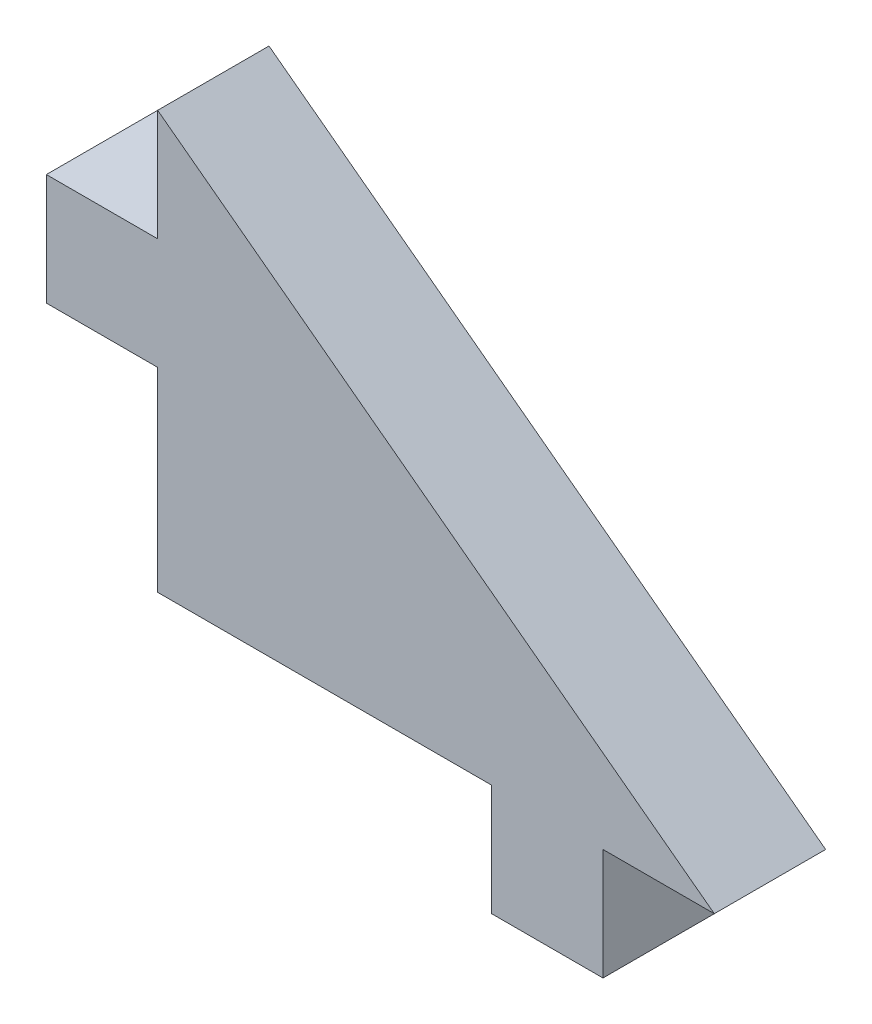
ISO-10303-21;
HEADER;
FILE_DESCRIPTION(('STEP AP214'),'2;1');
FILE_NAME('part.step','',(''),(''),'','','');
FILE_SCHEMA(('AUTOMOTIVE_DESIGN { 1 0 10303 214 1 1 1 1 }'));
ENDSEC;
DATA;
#1=APPLICATION_CONTEXT('core data for automotive mechanical design processes');
#2=APPLICATION_PROTOCOL_DEFINITION('international standard','automotive_design',2000,#1);
#3=PRODUCT_CONTEXT('',#1,'mechanical');
#4=PRODUCT('Part','Part','',(#3));
#5=PRODUCT_RELATED_PRODUCT_CATEGORY('part','',(#4));
#6=PRODUCT_DEFINITION_FORMATION('','',#4);
#7=PRODUCT_DEFINITION_CONTEXT('part definition',#1,'design');
#8=PRODUCT_DEFINITION('design','',#6,#7);
#9=PRODUCT_DEFINITION_SHAPE('','',#8);
#10=(LENGTH_UNIT() NAMED_UNIT(*) SI_UNIT(.MILLI.,.METRE.));
#11=(NAMED_UNIT(*) PLANE_ANGLE_UNIT() SI_UNIT($,.RADIAN.));
#12=(NAMED_UNIT(*) SI_UNIT($,.STERADIAN.) SOLID_ANGLE_UNIT());
#13=UNCERTAINTY_MEASURE_WITH_UNIT(LENGTH_MEASURE(1.E-05),#10,'distance_accuracy_value','');
#14=(GEOMETRIC_REPRESENTATION_CONTEXT(3) GLOBAL_UNCERTAINTY_ASSIGNED_CONTEXT((#13)) GLOBAL_UNIT_ASSIGNED_CONTEXT((#10,
#11,#12)) REPRESENTATION_CONTEXT('',''));
#15=CARTESIAN_POINT('',(0.,0.,0.));
#16=DIRECTION('',(0.,0.,1.));
#17=DIRECTION('',(1.,0.,0.));
#18=AXIS2_PLACEMENT_3D('',#15,#16,#17);
#19=CARTESIAN_POINT('',(0.,0.,8.));
#20=DIRECTION('',(0.,1.,0.));
#21=DIRECTION('',(0.,0.,1.));
#22=AXIS2_PLACEMENT_3D('',#19,#20,#21);
#23=PLANE('',#22);
#24=DIRECTION('',(0.,0.,1.));
#25=VECTOR('',#24,1.);
#26=CARTESIAN_POINT('',(32.,0.,8.));
#27=LINE('',#26,#25);
#28=CARTESIAN_POINT('',(32.,0.,0.));
#29=VERTEX_POINT('',#28);
#30=CARTESIAN_POINT('',(32.,0.,8.));
#31=VERTEX_POINT('',#30);
#32=EDGE_CURVE('E141',#29,#31,#27,.T.);
#33=ORIENTED_EDGE('',*,*,#32,.F.);
#34=DIRECTION('',(1.,0.,0.));
#35=VECTOR('',#34,1.);
#36=CARTESIAN_POINT('',(0.,0.,0.));
#37=LINE('',#36,#35);
#38=CARTESIAN_POINT('',(40.,0.,0.));
#39=VERTEX_POINT('',#38);
#40=EDGE_CURVE('E180',#29,#39,#37,.T.);
#41=ORIENTED_EDGE('',*,*,#40,.T.);
#42=DIRECTION('',(0.,0.,-1.));
#43=VECTOR('',#42,1.);
#44=CARTESIAN_POINT('',(40.,0.,8.));
#45=LINE('',#44,#43);
#46=CARTESIAN_POINT('',(40.,0.,8.));
#47=VERTEX_POINT('',#46);
#48=EDGE_CURVE('E11',#47,#39,#45,.T.);
#49=ORIENTED_EDGE('',*,*,#48,.F.);
#50=DIRECTION('',(1.,0.,0.));
#51=VECTOR('',#50,1.);
#52=CARTESIAN_POINT('',(0.,0.,8.));
#53=LINE('',#52,#51);
#54=EDGE_CURVE('E51',#31,#47,#53,.T.);
#55=ORIENTED_EDGE('',*,*,#54,.F.);
#56=EDGE_LOOP('',(#33,#41,#49,#55));
#57=FACE_BOUND('',#56,.T.);
#58=ADVANCED_FACE('F35',(#57),#23,.F.);
#59=DIRECTION('',(0.,0.,-1.));
#60=VECTOR('',#59,1.);
#61=CARTESIAN_POINT('',(24.,0.,8.));
#62=LINE('',#61,#60);
#63=CARTESIAN_POINT('',(24.,0.,8.));
#64=VERTEX_POINT('',#63);
#65=CARTESIAN_POINT('',(24.,0.,0.));
#66=VERTEX_POINT('',#65);
#67=EDGE_CURVE('E59',#64,#66,#62,.T.);
#68=ORIENTED_EDGE('',*,*,#67,.F.);
#69=CARTESIAN_POINT('',(0.,0.,8.));
#70=VERTEX_POINT('',#69);
#71=EDGE_CURVE('E192',#70,#64,#53,.T.);
#72=ORIENTED_EDGE('',*,*,#71,.F.);
#73=DIRECTION('',(0.,0.,-1.));
#74=VECTOR('',#73,1.);
#75=CARTESIAN_POINT('',(0.,0.,8.));
#76=LINE('',#75,#74);
#77=CARTESIAN_POINT('',(0.,0.,0.));
#78=VERTEX_POINT('',#77);
#79=EDGE_CURVE('E203',#70,#78,#76,.T.);
#80=ORIENTED_EDGE('',*,*,#79,.T.);
#81=EDGE_CURVE('E183',#78,#66,#37,.T.);
#82=ORIENTED_EDGE('',*,*,#81,.T.);
#83=EDGE_LOOP('',(#68,#72,#80,#82));
#84=FACE_BOUND('',#83,.T.);
#85=ADVANCED_FACE('F260',(#84),#23,.F.);
#86=CARTESIAN_POINT('',(0.,0.,8.));
#87=DIRECTION('',(1.,0.,0.));
#88=DIRECTION('',(0.,0.,-1.));
#89=AXIS2_PLACEMENT_3D('',#86,#87,#88);
#90=PLANE('',#89);
#91=DIRECTION('',(0.,0.,-1.));
#92=VECTOR('',#91,1.);
#93=CARTESIAN_POINT('',(0.,22.,0.));
#94=LINE('',#93,#92);
#95=CARTESIAN_POINT('',(0.,22.,8.));
#96=VERTEX_POINT('',#95);
#97=CARTESIAN_POINT('',(0.,22.,0.));
#98=VERTEX_POINT('',#97);
#99=EDGE_CURVE('E145',#96,#98,#94,.T.);
#100=ORIENTED_EDGE('',*,*,#99,.F.);
#101=DIRECTION('',(0.,-1.,0.));
#102=VECTOR('',#101,1.);
#103=CARTESIAN_POINT('',(0.,0.,8.));
#104=LINE('',#103,#102);
#105=CARTESIAN_POINT('',(0.,30.,8.));
#106=VERTEX_POINT('',#105);
#107=EDGE_CURVE('E215',#106,#96,#104,.T.);
#108=ORIENTED_EDGE('',*,*,#107,.F.);
#109=DIRECTION('',(0.,0.,-1.));
#110=VECTOR('',#109,1.);
#111=CARTESIAN_POINT('',(0.,30.,8.));
#112=LINE('',#111,#110);
#113=CARTESIAN_POINT('',(0.,30.,0.));
#114=VERTEX_POINT('',#113);
#115=EDGE_CURVE('E43',#106,#114,#112,.T.);
#116=ORIENTED_EDGE('',*,*,#115,.T.);
#117=DIRECTION('',(0.,-1.,0.));
#118=VECTOR('',#117,1.);
#119=CARTESIAN_POINT('',(0.,0.,0.));
#120=LINE('',#119,#118);
#121=EDGE_CURVE('E209',#114,#98,#120,.T.);
#122=ORIENTED_EDGE('',*,*,#121,.T.);
#123=EDGE_LOOP('',(#100,#108,#116,#122));
#124=FACE_BOUND('',#123,.T.);
#125=ADVANCED_FACE('F262',(#124),#90,.F.);
#126=DIRECTION('',(0.,0.,1.));
#127=VECTOR('',#126,1.);
#128=CARTESIAN_POINT('',(0.,14.,0.));
#129=LINE('',#128,#127);
#130=CARTESIAN_POINT('',(0.,14.,0.));
#131=VERTEX_POINT('',#130);
#132=CARTESIAN_POINT('',(0.,14.,8.));
#133=VERTEX_POINT('',#132);
#134=EDGE_CURVE('E142',#131,#133,#129,.T.);
#135=ORIENTED_EDGE('',*,*,#134,.F.);
#136=EDGE_CURVE('E200',#131,#78,#120,.T.);
#137=ORIENTED_EDGE('',*,*,#136,.T.);
#138=ORIENTED_EDGE('',*,*,#79,.F.);
#139=EDGE_CURVE('E218',#133,#70,#104,.T.);
#140=ORIENTED_EDGE('',*,*,#139,.F.);
#141=EDGE_LOOP('',(#135,#137,#138,#140));
#142=FACE_BOUND('',#141,.T.);
#143=ADVANCED_FACE('F258',(#142),#90,.F.);
#144=CARTESIAN_POINT('',(0.,30.,8.));
#145=DIRECTION('',(-0.6,-0.8,0.));
#146=DIRECTION('',(0.8,-0.6,0.));
#147=AXIS2_PLACEMENT_3D('',#144,#145,#146);
#148=PLANE('',#147);
#149=DIRECTION('',(-0.8,0.6,0.));
#150=VECTOR('',#149,1.);
#151=CARTESIAN_POINT('',(0.,30.,0.));
#152=LINE('',#151,#150);
#153=EDGE_CURVE('E182',#39,#114,#152,.T.);
#154=ORIENTED_EDGE('',*,*,#153,.T.);
#155=ORIENTED_EDGE('',*,*,#115,.F.);
#156=DIRECTION('',(-0.8,0.6,0.));
#157=VECTOR('',#156,1.);
#158=CARTESIAN_POINT('',(0.,30.,8.));
#159=LINE('',#158,#157);
#160=EDGE_CURVE('E221',#47,#106,#159,.T.);
#161=ORIENTED_EDGE('',*,*,#160,.F.);
#162=ORIENTED_EDGE('',*,*,#48,.T.);
#163=EDGE_LOOP('',(#154,#155,#161,#162));
#164=FACE_BOUND('',#163,.T.);
#165=ADVANCED_FACE('F289',(#164),#148,.F.);
#166=CARTESIAN_POINT('',(0.,0.,8.));
#167=DIRECTION('',(0.,0.,1.));
#168=DIRECTION('',(1.,0.,0.));
#169=AXIS2_PLACEMENT_3D('',#166,#167,#168);
#170=PLANE('',#169);
#171=ORIENTED_EDGE('',*,*,#71,.T.);
#172=DIRECTION('',(0.,1.,0.));
#173=VECTOR('',#172,1.);
#174=CARTESIAN_POINT('',(24.,-8.,8.));
#175=LINE('',#174,#173);
#176=CARTESIAN_POINT('',(24.,-8.,8.));
#177=VERTEX_POINT('',#176);
#178=EDGE_CURVE('E126',#177,#64,#175,.T.);
#179=ORIENTED_EDGE('',*,*,#178,.F.);
#180=DIRECTION('',(-1.,0.,0.));
#181=VECTOR('',#180,1.);
#182=CARTESIAN_POINT('',(32.,-8.,8.));
#183=LINE('',#182,#181);
#184=CARTESIAN_POINT('',(32.,-8.,8.));
#185=VERTEX_POINT('',#184);
#186=EDGE_CURVE('E119',#185,#177,#183,.T.);
#187=ORIENTED_EDGE('',*,*,#186,.F.);
#188=DIRECTION('',(0.,1.,0.));
#189=VECTOR('',#188,1.);
#190=CARTESIAN_POINT('',(32.,-8.,8.));
#191=LINE('',#190,#189);
#192=EDGE_CURVE('E123',#185,#31,#191,.T.);
#193=ORIENTED_EDGE('',*,*,#192,.T.);
#194=ORIENTED_EDGE('',*,*,#54,.T.);
#195=ORIENTED_EDGE('',*,*,#160,.T.);
#196=ORIENTED_EDGE('',*,*,#107,.T.);
#197=DIRECTION('',(1.,0.,0.));
#198=VECTOR('',#197,1.);
#199=CARTESIAN_POINT('',(-8.,22.,8.));
#200=LINE('',#199,#198);
#201=CARTESIAN_POINT('',(-8.,22.,8.));
#202=VERTEX_POINT('',#201);
#203=EDGE_CURVE('E241',#202,#96,#200,.T.);
#204=ORIENTED_EDGE('',*,*,#203,.F.);
#205=DIRECTION('',(0.,1.,0.));
#206=VECTOR('',#205,1.);
#207=CARTESIAN_POINT('',(-8.,22.,8.));
#208=LINE('',#207,#206);
#209=CARTESIAN_POINT('',(-8.,14.,8.));
#210=VERTEX_POINT('',#209);
#211=EDGE_CURVE('E250',#210,#202,#208,.T.);
#212=ORIENTED_EDGE('',*,*,#211,.F.);
#213=DIRECTION('',(1.,0.,0.));
#214=VECTOR('',#213,1.);
#215=CARTESIAN_POINT('',(-8.,14.,8.));
#216=LINE('',#215,#214);
#217=EDGE_CURVE('E188',#210,#133,#216,.T.);
#218=ORIENTED_EDGE('',*,*,#217,.T.);
#219=ORIENTED_EDGE('',*,*,#139,.T.);
#220=EDGE_LOOP('',(#171,#179,#187,#193,#194,#195,#196,#204,#212,#218,#219));
#221=FACE_BOUND('',#220,.T.);
#222=ADVANCED_FACE('F121',(#221),#170,.T.);
#223=CARTESIAN_POINT('',(0.,0.,0.));
#224=DIRECTION('',(0.,0.,1.));
#225=DIRECTION('',(1.,0.,0.));
#226=AXIS2_PLACEMENT_3D('',#223,#224,#225);
#227=PLANE('',#226);
#228=ORIENTED_EDGE('',*,*,#81,.F.);
#229=ORIENTED_EDGE('',*,*,#136,.F.);
#230=DIRECTION('',(1.,0.,0.));
#231=VECTOR('',#230,1.);
#232=CARTESIAN_POINT('',(-8.,14.,0.));
#233=LINE('',#232,#231);
#234=CARTESIAN_POINT('',(-8.,14.,0.));
#235=VERTEX_POINT('',#234);
#236=EDGE_CURVE('E184',#235,#131,#233,.T.);
#237=ORIENTED_EDGE('',*,*,#236,.F.);
#238=DIRECTION('',(0.,-1.,0.));
#239=VECTOR('',#238,1.);
#240=CARTESIAN_POINT('',(-8.,22.,0.));
#241=LINE('',#240,#239);
#242=CARTESIAN_POINT('',(-8.,22.,0.));
#243=VERTEX_POINT('',#242);
#244=EDGE_CURVE('E162',#243,#235,#241,.T.);
#245=ORIENTED_EDGE('',*,*,#244,.F.);
#246=DIRECTION('',(1.,0.,0.));
#247=VECTOR('',#246,1.);
#248=CARTESIAN_POINT('',(-8.,22.,0.));
#249=LINE('',#248,#247);
#250=EDGE_CURVE('E238',#243,#98,#249,.T.);
#251=ORIENTED_EDGE('',*,*,#250,.T.);
#252=ORIENTED_EDGE('',*,*,#121,.F.);
#253=ORIENTED_EDGE('',*,*,#153,.F.);
#254=ORIENTED_EDGE('',*,*,#40,.F.);
#255=DIRECTION('',(0.,1.,0.));
#256=VECTOR('',#255,1.);
#257=CARTESIAN_POINT('',(32.,-8.,0.));
#258=LINE('',#257,#256);
#259=CARTESIAN_POINT('',(32.,-8.,0.));
#260=VERTEX_POINT('',#259);
#261=EDGE_CURVE('E155',#260,#29,#258,.T.);
#262=ORIENTED_EDGE('',*,*,#261,.F.);
#263=DIRECTION('',(1.,0.,0.));
#264=VECTOR('',#263,1.);
#265=CARTESIAN_POINT('',(32.,-8.,0.));
#266=LINE('',#265,#264);
#267=CARTESIAN_POINT('',(24.,-8.,0.));
#268=VERTEX_POINT('',#267);
#269=EDGE_CURVE('E135',#268,#260,#266,.T.);
#270=ORIENTED_EDGE('',*,*,#269,.F.);
#271=DIRECTION('',(0.,1.,0.));
#272=VECTOR('',#271,1.);
#273=CARTESIAN_POINT('',(24.,-8.,0.));
#274=LINE('',#273,#272);
#275=EDGE_CURVE('E147',#268,#66,#274,.T.);
#276=ORIENTED_EDGE('',*,*,#275,.T.);
#277=EDGE_LOOP('',(#228,#229,#237,#245,#251,#252,#253,#254,#262,#270,#276));
#278=FACE_BOUND('',#277,.T.);
#279=ADVANCED_FACE('F177',(#278),#227,.F.);
#280=CARTESIAN_POINT('',(-8.,14.,0.));
#281=DIRECTION('',(0.,1.,0.));
#282=DIRECTION('',(0.,0.,1.));
#283=AXIS2_PLACEMENT_3D('',#280,#281,#282);
#284=PLANE('',#283);
#285=ORIENTED_EDGE('',*,*,#134,.T.);
#286=ORIENTED_EDGE('',*,*,#217,.F.);
#287=DIRECTION('',(0.,0.,1.));
#288=VECTOR('',#287,1.);
#289=CARTESIAN_POINT('',(-8.,14.,0.));
#290=LINE('',#289,#288);
#291=EDGE_CURVE('E253',#235,#210,#290,.T.);
#292=ORIENTED_EDGE('',*,*,#291,.F.);
#293=ORIENTED_EDGE('',*,*,#236,.T.);
#294=EDGE_LOOP('',(#285,#286,#292,#293));
#295=FACE_BOUND('',#294,.T.);
#296=ADVANCED_FACE('F252',(#295),#284,.F.);
#297=CARTESIAN_POINT('',(-8.,22.,0.));
#298=DIRECTION('',(0.,-1.,0.));
#299=DIRECTION('',(0.,0.,-1.));
#300=AXIS2_PLACEMENT_3D('',#297,#298,#299);
#301=PLANE('',#300);
#302=ORIENTED_EDGE('',*,*,#99,.T.);
#303=ORIENTED_EDGE('',*,*,#250,.F.);
#304=DIRECTION('',(0.,0.,-1.));
#305=VECTOR('',#304,1.);
#306=CARTESIAN_POINT('',(-8.,22.,0.));
#307=LINE('',#306,#305);
#308=EDGE_CURVE('E229',#202,#243,#307,.T.);
#309=ORIENTED_EDGE('',*,*,#308,.F.);
#310=ORIENTED_EDGE('',*,*,#203,.T.);
#311=EDGE_LOOP('',(#302,#303,#309,#310));
#312=FACE_BOUND('',#311,.T.);
#313=ADVANCED_FACE('F331',(#312),#301,.F.);
#314=CARTESIAN_POINT('',(-8.,14.,0.));
#315=DIRECTION('',(-1.,0.,0.));
#316=DIRECTION('',(0.,0.,1.));
#317=AXIS2_PLACEMENT_3D('',#314,#315,#316);
#318=PLANE('',#317);
#319=ORIENTED_EDGE('',*,*,#244,.T.);
#320=ORIENTED_EDGE('',*,*,#291,.T.);
#321=ORIENTED_EDGE('',*,*,#211,.T.);
#322=ORIENTED_EDGE('',*,*,#308,.T.);
#323=EDGE_LOOP('',(#319,#320,#321,#322));
#324=FACE_BOUND('',#323,.T.);
#325=ADVANCED_FACE('F277',(#324),#318,.T.);
#326=CARTESIAN_POINT('',(32.,-8.,8.));
#327=DIRECTION('',(-1.,0.,0.));
#328=DIRECTION('',(0.,0.,1.));
#329=AXIS2_PLACEMENT_3D('',#326,#327,#328);
#330=PLANE('',#329);
#331=ORIENTED_EDGE('',*,*,#32,.T.);
#332=ORIENTED_EDGE('',*,*,#192,.F.);
#333=DIRECTION('',(0.,0.,1.));
#334=VECTOR('',#333,1.);
#335=CARTESIAN_POINT('',(32.,-8.,8.));
#336=LINE('',#335,#334);
#337=EDGE_CURVE('E130',#260,#185,#336,.T.);
#338=ORIENTED_EDGE('',*,*,#337,.F.);
#339=ORIENTED_EDGE('',*,*,#261,.T.);
#340=EDGE_LOOP('',(#331,#332,#338,#339));
#341=FACE_BOUND('',#340,.T.);
#342=ADVANCED_FACE('F140',(#341),#330,.F.);
#343=CARTESIAN_POINT('',(24.,-8.,8.));
#344=DIRECTION('',(1.,0.,0.));
#345=DIRECTION('',(0.,0.,-1.));
#346=AXIS2_PLACEMENT_3D('',#343,#344,#345);
#347=PLANE('',#346);
#348=ORIENTED_EDGE('',*,*,#67,.T.);
#349=ORIENTED_EDGE('',*,*,#275,.F.);
#350=DIRECTION('',(0.,0.,-1.));
#351=VECTOR('',#350,1.);
#352=CARTESIAN_POINT('',(24.,-8.,8.));
#353=LINE('',#352,#351);
#354=EDGE_CURVE('E129',#177,#268,#353,.T.);
#355=ORIENTED_EDGE('',*,*,#354,.F.);
#356=ORIENTED_EDGE('',*,*,#178,.T.);
#357=EDGE_LOOP('',(#348,#349,#355,#356));
#358=FACE_BOUND('',#357,.T.);
#359=ADVANCED_FACE('F176',(#358),#347,.F.);
#360=CARTESIAN_POINT('',(32.,-8.,0.));
#361=DIRECTION('',(0.,1.,0.));
#362=DIRECTION('',(0.,0.,1.));
#363=AXIS2_PLACEMENT_3D('',#360,#361,#362);
#364=PLANE('',#363);
#365=ORIENTED_EDGE('',*,*,#337,.T.);
#366=ORIENTED_EDGE('',*,*,#186,.T.);
#367=ORIENTED_EDGE('',*,*,#354,.T.);
#368=ORIENTED_EDGE('',*,*,#269,.T.);
#369=EDGE_LOOP('',(#365,#366,#367,#368));
#370=FACE_BOUND('',#369,.T.);
#371=ADVANCED_FACE('F133',(#370),#364,.F.);
#372=CLOSED_SHELL('',(#58,#85,#125,#143,#165,#222,#279,#296,#313,#325,#342,#359,#371));
#373=MANIFOLD_SOLID_BREP('B2',#372);
#374=ADVANCED_BREP_SHAPE_REPRESENTATION('',(#18,#373),#14);
#375=SHAPE_DEFINITION_REPRESENTATION(#9,#374);
ENDSEC;
END-ISO-10303-21;
